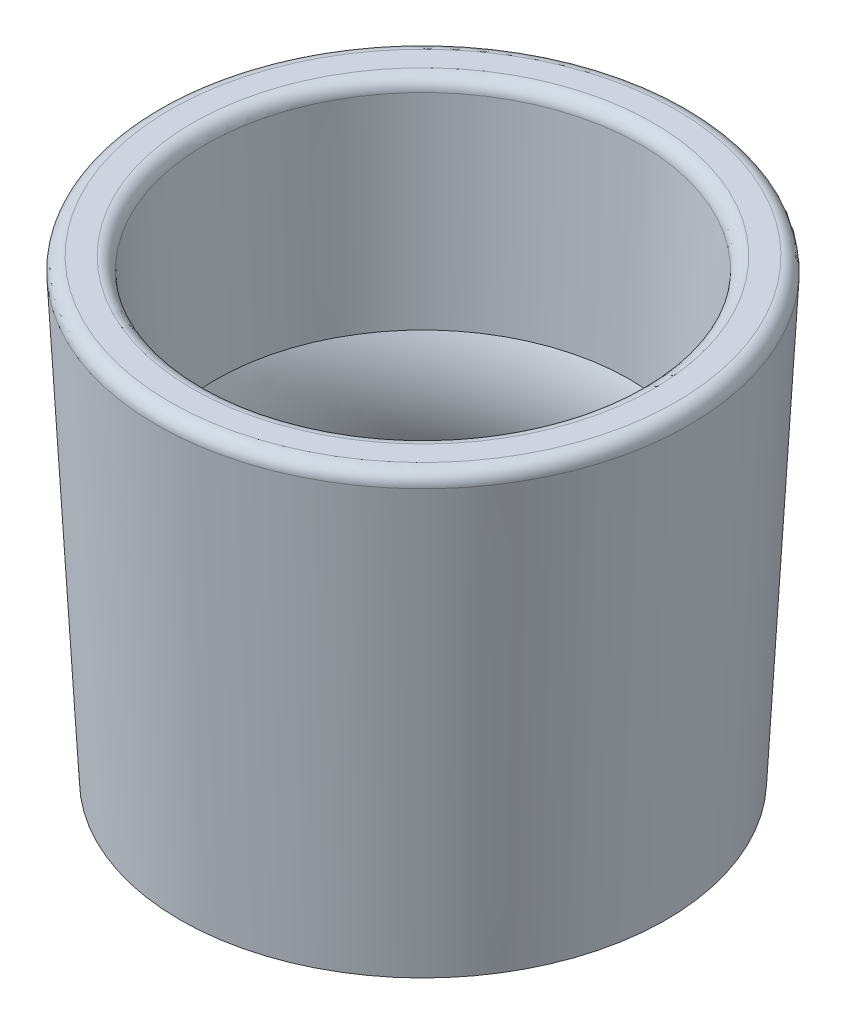
ISO-10303-21;
HEADER;
FILE_DESCRIPTION(('STEP AP214'),'2;1');
FILE_NAME('part.step','',(''),(''),'','','');
FILE_SCHEMA(('AUTOMOTIVE_DESIGN { 1 0 10303 214 1 1 1 1 }'));
ENDSEC;
DATA;
#1=APPLICATION_CONTEXT('core data for automotive mechanical design processes');
#2=APPLICATION_PROTOCOL_DEFINITION('international standard','automotive_design',2000,#1);
#3=PRODUCT_CONTEXT('',#1,'mechanical');
#4=PRODUCT('Part','Part','',(#3));
#5=PRODUCT_RELATED_PRODUCT_CATEGORY('part','',(#4));
#6=PRODUCT_DEFINITION_FORMATION('','',#4);
#7=PRODUCT_DEFINITION_CONTEXT('part definition',#1,'design');
#8=PRODUCT_DEFINITION('design','',#6,#7);
#9=PRODUCT_DEFINITION_SHAPE('','',#8);
#10=(LENGTH_UNIT() NAMED_UNIT(*) SI_UNIT(.MILLI.,.METRE.));
#11=(NAMED_UNIT(*) PLANE_ANGLE_UNIT() SI_UNIT($,.RADIAN.));
#12=(NAMED_UNIT(*) SI_UNIT($,.STERADIAN.) SOLID_ANGLE_UNIT());
#13=UNCERTAINTY_MEASURE_WITH_UNIT(LENGTH_MEASURE(1.E-05),#10,'distance_accuracy_value','');
#14=(GEOMETRIC_REPRESENTATION_CONTEXT(3) GLOBAL_UNCERTAINTY_ASSIGNED_CONTEXT((#13)) GLOBAL_UNIT_ASSIGNED_CONTEXT((#10,
#11,#12)) REPRESENTATION_CONTEXT('',''));
#15=CARTESIAN_POINT('',(0.,0.,0.));
#16=DIRECTION('',(0.,0.,1.));
#17=DIRECTION('',(1.,0.,0.));
#18=AXIS2_PLACEMENT_3D('',#15,#16,#17);
#19=CARTESIAN_POINT('',(0.,0.,0.));
#20=DIRECTION('',(0.,1.,0.));
#21=DIRECTION('',(0.,0.,1.));
#22=AXIS2_PLACEMENT_3D('',#19,#20,#21);
#23=CONICAL_SURFACE('',#22,7.5,0.0523598775598299);
#24=CARTESIAN_POINT('',(0.,13.5790656175028,0.));
#25=DIRECTION('',(0.,1.,0.));
#26=DIRECTION('',(0.,0.,1.));
#27=AXIS2_PLACEMENT_3D('',#24,#25,#26);
#28=CIRCLE('',#27,8.21164867375203);
#29=CARTESIAN_POINT('',(0.,13.5790656175028,8.21164867375203));
#30=VERTEX_POINT('',#29);
#31=EDGE_CURVE('E44',#30,#30,#28,.F.);
#32=ORIENTED_EDGE('',*,*,#31,.T.);
#33=EDGE_LOOP('',(#32));
#34=FACE_BOUND('',#33,.T.);
#35=CARTESIAN_POINT('',(0.,0.,0.));
#36=DIRECTION('',(0.,1.,0.));
#37=DIRECTION('',(0.,0.,1.));
#38=AXIS2_PLACEMENT_3D('',#35,#36,#37);
#39=CIRCLE('',#38,7.5);
#40=CARTESIAN_POINT('',(0.,0.,7.5));
#41=VERTEX_POINT('',#40);
#42=EDGE_CURVE('E57',#41,#41,#39,.T.);
#43=ORIENTED_EDGE('',*,*,#42,.T.);
#44=EDGE_LOOP('',(#43));
#45=FACE_BOUND('',#44,.T.);
#46=ADVANCED_FACE('F37',(#34,#45),#23,.T.);
#47=CARTESIAN_POINT('',(0.,14.,0.));
#48=DIRECTION('',(0.,1.,0.));
#49=DIRECTION('',(0.,0.,1.));
#50=AXIS2_PLACEMENT_3D('',#47,#48,#49);
#51=PLANE('',#50);
#52=CARTESIAN_POINT('',(0.,14.,0.));
#53=DIRECTION('',(0.,1.,0.));
#54=DIRECTION('',(0.,0.,1.));
#55=AXIS2_PLACEMENT_3D('',#52,#53,#54);
#56=CIRCLE('',#55,7.81219685985019);
#57=CARTESIAN_POINT('',(0.,14.,7.81219685985019));
#58=VERTEX_POINT('',#57);
#59=EDGE_CURVE('E48',#58,#58,#56,.T.);
#60=ORIENTED_EDGE('',*,*,#59,.T.);
#61=EDGE_LOOP('',(#60));
#62=FACE_BOUND('',#61,.T.);
#63=CARTESIAN_POINT('',(0.,14.,0.));
#64=DIRECTION('',(0.,1.,0.));
#65=DIRECTION('',(0.,0.,1.));
#66=AXIS2_PLACEMENT_3D('',#63,#64,#65);
#67=CIRCLE('',#66,7.11123621765165);
#68=CARTESIAN_POINT('',(0.,14.,7.11123621765165));
#69=VERTEX_POINT('',#68);
#70=EDGE_CURVE('E52',#69,#69,#67,.F.);
#71=ORIENTED_EDGE('',*,*,#70,.T.);
#72=EDGE_LOOP('',(#71));
#73=FACE_BOUND('',#72,.T.);
#74=ADVANCED_FACE('F112',(#62,#73),#51,.T.);
#75=CARTESIAN_POINT('',(0.,0.,0.));
#76=DIRECTION('',(0.,1.,0.));
#77=DIRECTION('',(0.,0.,1.));
#78=AXIS2_PLACEMENT_3D('',#75,#76,#77);
#79=PLANE('',#78);
#80=CARTESIAN_POINT('',(0.,0.,0.));
#81=DIRECTION('',(0.,1.,0.));
#82=DIRECTION('',(0.,0.,1.));
#83=AXIS2_PLACEMENT_3D('',#80,#81,#82);
#84=CIRCLE('',#83,0.8);
#85=CARTESIAN_POINT('',(0.,0.,0.8));
#86=VERTEX_POINT('',#85);
#87=EDGE_CURVE('E69',#86,#86,#84,.T.);
#88=ORIENTED_EDGE('',*,*,#87,.T.);
#89=EDGE_LOOP('',(#88));
#90=FACE_BOUND('',#89,.T.);
#91=ORIENTED_EDGE('',*,*,#42,.F.);
#92=EDGE_LOOP('',(#91));
#93=FACE_BOUND('',#92,.T.);
#94=ADVANCED_FACE('F76',(#90,#93),#79,.F.);
#95=CARTESIAN_POINT('',(-6.07655314992768,1.5,0.));
#96=DIRECTION('',(0.,1.,0.));
#97=DIRECTION('',(0.,0.,1.));
#98=AXIS2_PLACEMENT_3D('',#95,#96,#97);
#99=PLANE('',#98);
#100=CARTESIAN_POINT('',(0.,1.5,0.));
#101=DIRECTION('',(0.,1.,0.));
#102=DIRECTION('',(0.,0.,1.));
#103=AXIS2_PLACEMENT_3D('',#100,#101,#102);
#104=CIRCLE('',#103,0.8);
#105=CARTESIAN_POINT('',(0.,1.5,0.8));
#106=VERTEX_POINT('',#105);
#107=EDGE_CURVE('E70',#106,#106,#104,.T.);
#108=ORIENTED_EDGE('',*,*,#107,.F.);
#109=EDGE_LOOP('',(#108));
#110=FACE_BOUND('',#109,.T.);
#111=CARTESIAN_POINT('',(0.,1.5,0.));
#112=DIRECTION('',(0.,-1.,0.));
#113=DIRECTION('',(0.,0.,-1.));
#114=AXIS2_PLACEMENT_3D('',#111,#112,#113);
#115=CIRCLE('',#114,6.07655314992768);
#116=CARTESIAN_POINT('',(0.,1.5,-6.07655314992768));
#117=VERTEX_POINT('',#116);
#118=EDGE_CURVE('E60',#117,#117,#115,.T.);
#119=ORIENTED_EDGE('',*,*,#118,.F.);
#120=EDGE_LOOP('',(#119));
#121=FACE_BOUND('',#120,.T.);
#122=ADVANCED_FACE('F87',(#110,#121),#99,.T.);
#123=CARTESIAN_POINT('',(0.,4.5,0.));
#124=DIRECTION('',(0.,1.,0.));
#125=DIRECTION('',(0.,0.,1.));
#126=AXIS2_PLACEMENT_3D('',#123,#124,#125);
#127=CONICAL_SURFACE('',#126,6.23377648777681,0.0523598775598304);
#128=ORIENTED_EDGE('',*,*,#118,.T.);
#129=EDGE_LOOP('',(#128));
#130=FACE_BOUND('',#129,.T.);
#131=CARTESIAN_POINT('',(0.,4.5,0.));
#132=DIRECTION('',(0.,-1.,0.));
#133=DIRECTION('',(0.,0.,-1.));
#134=AXIS2_PLACEMENT_3D('',#131,#132,#133);
#135=CIRCLE('',#134,6.23377648777681);
#136=CARTESIAN_POINT('',(0.,4.5,-6.23377648777681));
#137=VERTEX_POINT('',#136);
#138=EDGE_CURVE('E63',#137,#137,#135,.T.);
#139=ORIENTED_EDGE('',*,*,#138,.F.);
#140=EDGE_LOOP('',(#139));
#141=FACE_BOUND('',#140,.T.);
#142=ADVANCED_FACE('F90',(#130,#141),#127,.F.);
#143=CARTESIAN_POINT('',(0.,5.80597669582571,0.));
#144=DIRECTION('',(0.,-1.,0.));
#145=DIRECTION('',(0.,0.,-1.));
#146=AXIS2_PLACEMENT_3D('',#143,#144,#145);
#147=TOROIDAL_SURFACE('',#146,10.0145733442556,4.);
#148=ORIENTED_EDGE('',*,*,#138,.T.);
#149=EDGE_LOOP('',(#148));
#150=FACE_BOUND('',#149,.T.);
#151=CARTESIAN_POINT('',(0.,7.5,0.));
#152=DIRECTION('',(0.,-1.,0.));
#153=DIRECTION('',(0.,0.,-1.));
#154=AXIS2_PLACEMENT_3D('',#151,#152,#153);
#155=CIRCLE('',#154,6.39099982562593);
#156=CARTESIAN_POINT('',(0.,7.5,-6.39099982562593));
#157=VERTEX_POINT('',#156);
#158=EDGE_CURVE('E66',#157,#157,#155,.T.);
#159=ORIENTED_EDGE('',*,*,#158,.F.);
#160=EDGE_LOOP('',(#159));
#161=FACE_BOUND('',#160,.T.);
#162=ADVANCED_FACE('F96',(#150,#161),#147,.T.);
#163=CARTESIAN_POINT('',(0.,14.,0.));
#164=DIRECTION('',(0.,1.,0.));
#165=DIRECTION('',(0.,0.,1.));
#166=AXIS2_PLACEMENT_3D('',#163,#164,#165);
#167=CONICAL_SURFACE('',#166,6.7316503909657,0.0523598775598299);
#168=CARTESIAN_POINT('',(0.,13.6209343824972,0.));
#169=DIRECTION('',(0.,-1.,0.));
#170=DIRECTION('',(0.,0.,-1.));
#171=AXIS2_PLACEMENT_3D('',#168,#169,#170);
#172=CIRCLE('',#171,6.71178440374982);
#173=CARTESIAN_POINT('',(0.,13.6209343824972,-6.71178440374982));
#174=VERTEX_POINT('',#173);
#175=EDGE_CURVE('E10',#174,#174,#172,.F.);
#176=ORIENTED_EDGE('',*,*,#175,.T.);
#177=EDGE_LOOP('',(#176));
#178=FACE_BOUND('',#177,.T.);
#179=ORIENTED_EDGE('',*,*,#158,.T.);
#180=EDGE_LOOP('',(#179));
#181=FACE_BOUND('',#180,.T.);
#182=ADVANCED_FACE('F83',(#178,#181),#167,.F.);
#183=CARTESIAN_POINT('',(0.,0.,0.));
#184=DIRECTION('',(0.,1.,0.));
#185=DIRECTION('',(0.,0.,1.));
#186=AXIS2_PLACEMENT_3D('',#183,#184,#185);
#187=CYLINDRICAL_SURFACE('',#186,0.8);
#188=ORIENTED_EDGE('',*,*,#87,.F.);
#189=EDGE_LOOP('',(#188));
#190=FACE_BOUND('',#189,.T.);
#191=ORIENTED_EDGE('',*,*,#107,.T.);
#192=EDGE_LOOP('',(#191));
#193=FACE_BOUND('',#192,.T.);
#194=ADVANCED_FACE('F79',(#190,#193),#187,.F.);
#195=CARTESIAN_POINT('',(0.,13.6,0.));
#196=DIRECTION('',(0.,1.,0.));
#197=DIRECTION('',(0.,0.,1.));
#198=AXIS2_PLACEMENT_3D('',#195,#196,#197);
#199=TOROIDAL_SURFACE('',#198,7.81219685985019,0.4);
#200=ORIENTED_EDGE('',*,*,#31,.F.);
#201=EDGE_LOOP('',(#200));
#202=FACE_BOUND('',#201,.T.);
#203=ORIENTED_EDGE('',*,*,#59,.F.);
#204=EDGE_LOOP('',(#203));
#205=FACE_BOUND('',#204,.T.);
#206=ADVANCED_FACE('F82',(#202,#205),#199,.T.);
#207=CARTESIAN_POINT('',(0.,13.6,0.));
#208=DIRECTION('',(0.,1.,0.));
#209=DIRECTION('',(0.,0.,1.));
#210=AXIS2_PLACEMENT_3D('',#207,#208,#209);
#211=TOROIDAL_SURFACE('',#210,7.11123621765165,0.4);
#212=ORIENTED_EDGE('',*,*,#175,.F.);
#213=EDGE_LOOP('',(#212));
#214=FACE_BOUND('',#213,.T.);
#215=ORIENTED_EDGE('',*,*,#70,.F.);
#216=EDGE_LOOP('',(#215));
#217=FACE_BOUND('',#216,.T.);
#218=ADVANCED_FACE('F39',(#214,#217),#211,.T.);
#219=CLOSED_SHELL('',(#46,#74,#94,#122,#142,#162,#182,#194,#206,#218));
#220=MANIFOLD_SOLID_BREP('B2',#219);
#221=ADVANCED_BREP_SHAPE_REPRESENTATION('',(#18,#220),#14);
#222=SHAPE_DEFINITION_REPRESENTATION(#9,#221);
ENDSEC;
END-ISO-10303-21;
